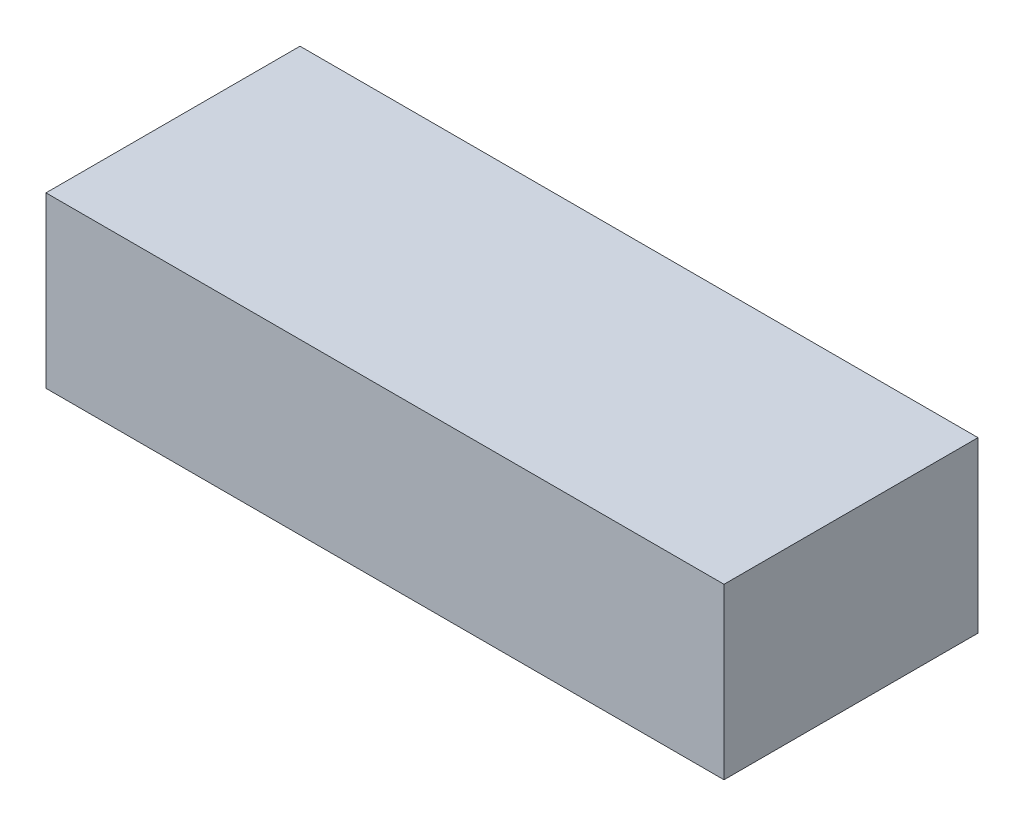
ISO-10303-21;
HEADER;
FILE_DESCRIPTION(('STEP AP214'),'2;1');
FILE_NAME('part.step','',(''),(''),'','','');
FILE_SCHEMA(('AUTOMOTIVE_DESIGN { 1 0 10303 214 1 1 1 1 }'));
ENDSEC;
DATA;
#1=APPLICATION_CONTEXT('core data for automotive mechanical design processes');
#2=APPLICATION_PROTOCOL_DEFINITION('international standard','automotive_design',2000,#1);
#3=PRODUCT_CONTEXT('',#1,'mechanical');
#4=PRODUCT('Part','Part','',(#3));
#5=PRODUCT_RELATED_PRODUCT_CATEGORY('part','',(#4));
#6=PRODUCT_DEFINITION_FORMATION('','',#4);
#7=PRODUCT_DEFINITION_CONTEXT('part definition',#1,'design');
#8=PRODUCT_DEFINITION('design','',#6,#7);
#9=PRODUCT_DEFINITION_SHAPE('','',#8);
#10=(LENGTH_UNIT() NAMED_UNIT(*) SI_UNIT(.MILLI.,.METRE.));
#11=(NAMED_UNIT(*) PLANE_ANGLE_UNIT() SI_UNIT($,.RADIAN.));
#12=(NAMED_UNIT(*) SI_UNIT($,.STERADIAN.) SOLID_ANGLE_UNIT());
#13=UNCERTAINTY_MEASURE_WITH_UNIT(LENGTH_MEASURE(1.E-05),#10,'distance_accuracy_value','');
#14=(GEOMETRIC_REPRESENTATION_CONTEXT(3) GLOBAL_UNCERTAINTY_ASSIGNED_CONTEXT((#13)) GLOBAL_UNIT_ASSIGNED_CONTEXT((#10,
#11,#12)) REPRESENTATION_CONTEXT('',''));
#15=CARTESIAN_POINT('',(0.,0.,0.));
#16=DIRECTION('',(0.,0.,1.));
#17=DIRECTION('',(1.,0.,0.));
#18=AXIS2_PLACEMENT_3D('',#15,#16,#17);
#19=CARTESIAN_POINT('',(0.,2440.,0.));
#20=DIRECTION('',(0.,0.,-1.));
#21=DIRECTION('',(-1.,0.,0.));
#22=AXIS2_PLACEMENT_3D('',#19,#20,#21);
#23=PLANE('',#22);
#24=DIRECTION('',(1.,0.,0.));
#25=VECTOR('',#24,1.);
#26=CARTESIAN_POINT('',(0.,0.,0.));
#27=LINE('',#26,#25);
#28=CARTESIAN_POINT('',(0.,0.,0.));
#29=VERTEX_POINT('',#28);
#30=CARTESIAN_POINT('',(9770.,0.,0.));
#31=VERTEX_POINT('',#30);
#32=EDGE_CURVE('E110',#29,#31,#27,.T.);
#33=ORIENTED_EDGE('',*,*,#32,.F.);
#34=DIRECTION('',(0.,-1.,0.));
#35=VECTOR('',#34,1.);
#36=CARTESIAN_POINT('',(0.,2440.,0.));
#37=LINE('',#36,#35);
#38=CARTESIAN_POINT('',(0.,2440.,0.));
#39=VERTEX_POINT('',#38);
#40=EDGE_CURVE('E11',#39,#29,#37,.T.);
#41=ORIENTED_EDGE('',*,*,#40,.F.);
#42=DIRECTION('',(1.,0.,0.));
#43=VECTOR('',#42,1.);
#44=CARTESIAN_POINT('',(0.,2440.,0.));
#45=LINE('',#44,#43);
#46=CARTESIAN_POINT('',(9770.,2440.,0.));
#47=VERTEX_POINT('',#46);
#48=EDGE_CURVE('E103',#39,#47,#45,.T.);
#49=ORIENTED_EDGE('',*,*,#48,.T.);
#50=DIRECTION('',(0.,-1.,0.));
#51=VECTOR('',#50,1.);
#52=CARTESIAN_POINT('',(9770.,2440.,0.));
#53=LINE('',#52,#51);
#54=EDGE_CURVE('E42',#47,#31,#53,.T.);
#55=ORIENTED_EDGE('',*,*,#54,.T.);
#56=EDGE_LOOP('',(#33,#41,#49,#55));
#57=FACE_BOUND('',#56,.T.);
#58=ADVANCED_FACE('F39',(#57),#23,.T.);
#59=CARTESIAN_POINT('',(0.,2440.,0.));
#60=DIRECTION('',(1.,0.,0.));
#61=DIRECTION('',(0.,0.,-1.));
#62=AXIS2_PLACEMENT_3D('',#59,#60,#61);
#63=PLANE('',#62);
#64=DIRECTION('',(0.,0.,1.));
#65=VECTOR('',#64,1.);
#66=CARTESIAN_POINT('',(0.,0.,0.));
#67=LINE('',#66,#65);
#68=CARTESIAN_POINT('',(4.48220728487931E-13,0.,3660.));
#69=VERTEX_POINT('',#68);
#70=EDGE_CURVE('E73',#29,#69,#67,.T.);
#71=ORIENTED_EDGE('',*,*,#70,.T.);
#72=DIRECTION('',(0.,-1.,0.));
#73=VECTOR('',#72,1.);
#74=CARTESIAN_POINT('',(4.48220728487931E-13,2440.,3660.));
#75=LINE('',#74,#73);
#76=CARTESIAN_POINT('',(4.48220728487931E-13,2440.,3660.));
#77=VERTEX_POINT('',#76);
#78=EDGE_CURVE('E49',#77,#69,#75,.T.);
#79=ORIENTED_EDGE('',*,*,#78,.F.);
#80=DIRECTION('',(0.,0.,1.));
#81=VECTOR('',#80,1.);
#82=CARTESIAN_POINT('',(0.,2440.,0.));
#83=LINE('',#82,#81);
#84=EDGE_CURVE('E90',#39,#77,#83,.T.);
#85=ORIENTED_EDGE('',*,*,#84,.F.);
#86=ORIENTED_EDGE('',*,*,#40,.T.);
#87=EDGE_LOOP('',(#71,#79,#85,#86));
#88=FACE_BOUND('',#87,.T.);
#89=ADVANCED_FACE('F126',(#88),#63,.F.);
#90=CARTESIAN_POINT('',(4.48220728487931E-13,2440.,3660.));
#91=DIRECTION('',(0.,0.,-1.));
#92=DIRECTION('',(-1.,0.,0.));
#93=AXIS2_PLACEMENT_3D('',#90,#91,#92);
#94=PLANE('',#93);
#95=DIRECTION('',(1.,0.,0.));
#96=VECTOR('',#95,1.);
#97=CARTESIAN_POINT('',(4.48220728487931E-13,0.,3660.));
#98=LINE('',#97,#96);
#99=CARTESIAN_POINT('',(9770.,0.,3660.));
#100=VERTEX_POINT('',#99);
#101=EDGE_CURVE('E98',#69,#100,#98,.T.);
#102=ORIENTED_EDGE('',*,*,#101,.T.);
#103=DIRECTION('',(0.,-1.,0.));
#104=VECTOR('',#103,1.);
#105=CARTESIAN_POINT('',(9770.,2440.,3660.));
#106=LINE('',#105,#104);
#107=CARTESIAN_POINT('',(9770.,2440.,3660.));
#108=VERTEX_POINT('',#107);
#109=EDGE_CURVE('E95',#108,#100,#106,.T.);
#110=ORIENTED_EDGE('',*,*,#109,.F.);
#111=DIRECTION('',(1.,0.,0.));
#112=VECTOR('',#111,1.);
#113=CARTESIAN_POINT('',(4.48220728487931E-13,2440.,3660.));
#114=LINE('',#113,#112);
#115=EDGE_CURVE('E85',#77,#108,#114,.T.);
#116=ORIENTED_EDGE('',*,*,#115,.F.);
#117=ORIENTED_EDGE('',*,*,#78,.T.);
#118=EDGE_LOOP('',(#102,#110,#116,#117));
#119=FACE_BOUND('',#118,.T.);
#120=ADVANCED_FACE('F96',(#119),#94,.F.);
#121=CARTESIAN_POINT('',(9770.,2440.,0.));
#122=DIRECTION('',(1.,0.,0.));
#123=DIRECTION('',(0.,0.,-1.));
#124=AXIS2_PLACEMENT_3D('',#121,#122,#123);
#125=PLANE('',#124);
#126=DIRECTION('',(0.,0.,1.));
#127=VECTOR('',#126,1.);
#128=CARTESIAN_POINT('',(9770.,0.,0.));
#129=LINE('',#128,#127);
#130=EDGE_CURVE('E114',#31,#100,#129,.T.);
#131=ORIENTED_EDGE('',*,*,#130,.F.);
#132=ORIENTED_EDGE('',*,*,#54,.F.);
#133=DIRECTION('',(0.,0.,1.));
#134=VECTOR('',#133,1.);
#135=CARTESIAN_POINT('',(9770.,2440.,0.));
#136=LINE('',#135,#134);
#137=EDGE_CURVE('E89',#47,#108,#136,.T.);
#138=ORIENTED_EDGE('',*,*,#137,.T.);
#139=ORIENTED_EDGE('',*,*,#109,.T.);
#140=EDGE_LOOP('',(#131,#132,#138,#139));
#141=FACE_BOUND('',#140,.T.);
#142=ADVANCED_FACE('F101',(#141),#125,.T.);
#143=CARTESIAN_POINT('',(0.,2440.,0.));
#144=DIRECTION('',(0.,-1.,0.));
#145=DIRECTION('',(0.,0.,-1.));
#146=AXIS2_PLACEMENT_3D('',#143,#144,#145);
#147=PLANE('',#146);
#148=ORIENTED_EDGE('',*,*,#48,.F.);
#149=ORIENTED_EDGE('',*,*,#84,.T.);
#150=ORIENTED_EDGE('',*,*,#115,.T.);
#151=ORIENTED_EDGE('',*,*,#137,.F.);
#152=EDGE_LOOP('',(#148,#149,#150,#151));
#153=FACE_BOUND('',#152,.T.);
#154=ADVANCED_FACE('F88',(#153),#147,.F.);
#155=CARTESIAN_POINT('',(0.,0.,0.));
#156=DIRECTION('',(0.,-1.,0.));
#157=DIRECTION('',(0.,0.,-1.));
#158=AXIS2_PLACEMENT_3D('',#155,#156,#157);
#159=PLANE('',#158);
#160=ORIENTED_EDGE('',*,*,#32,.T.);
#161=ORIENTED_EDGE('',*,*,#130,.T.);
#162=ORIENTED_EDGE('',*,*,#101,.F.);
#163=ORIENTED_EDGE('',*,*,#70,.F.);
#164=EDGE_LOOP('',(#160,#161,#162,#163));
#165=FACE_BOUND('',#164,.T.);
#166=ADVANCED_FACE('F123',(#165),#159,.T.);
#167=CLOSED_SHELL('',(#58,#89,#120,#142,#154,#166));
#168=MANIFOLD_SOLID_BREP('B2',#167);
#169=ADVANCED_BREP_SHAPE_REPRESENTATION('',(#18,#168),#14);
#170=SHAPE_DEFINITION_REPRESENTATION(#9,#169);
ENDSEC;
END-ISO-10303-21;
